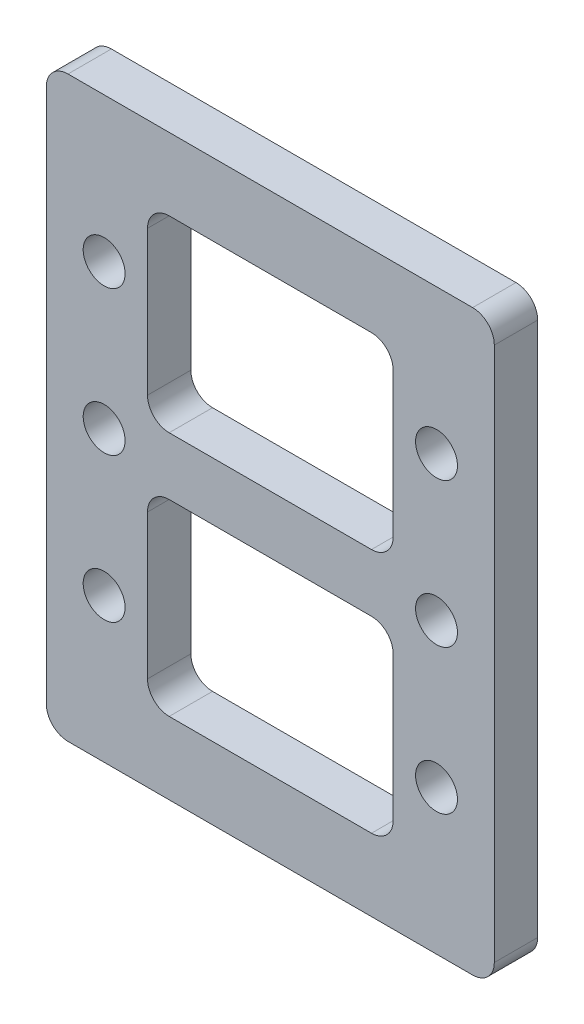
ISO-10303-21;
HEADER;
FILE_DESCRIPTION(('STEP AP214'),'2;1');
FILE_NAME('part.step','',(''),(''),'','','');
FILE_SCHEMA(('AUTOMOTIVE_DESIGN { 1 0 10303 214 1 1 1 1 }'));
ENDSEC;
DATA;
#1=APPLICATION_CONTEXT('core data for automotive mechanical design processes');
#2=APPLICATION_PROTOCOL_DEFINITION('international standard','automotive_design',2000,#1);
#3=PRODUCT_CONTEXT('',#1,'mechanical');
#4=PRODUCT('Part','Part','',(#3));
#5=PRODUCT_RELATED_PRODUCT_CATEGORY('part','',(#4));
#6=PRODUCT_DEFINITION_FORMATION('','',#4);
#7=PRODUCT_DEFINITION_CONTEXT('part definition',#1,'design');
#8=PRODUCT_DEFINITION('design','',#6,#7);
#9=PRODUCT_DEFINITION_SHAPE('','',#8);
#10=(LENGTH_UNIT() NAMED_UNIT(*) SI_UNIT(.MILLI.,.METRE.));
#11=(NAMED_UNIT(*) PLANE_ANGLE_UNIT() SI_UNIT($,.RADIAN.));
#12=(NAMED_UNIT(*) SI_UNIT($,.STERADIAN.) SOLID_ANGLE_UNIT());
#13=UNCERTAINTY_MEASURE_WITH_UNIT(LENGTH_MEASURE(1.E-05),#10,'distance_accuracy_value','');
#14=(GEOMETRIC_REPRESENTATION_CONTEXT(3) GLOBAL_UNCERTAINTY_ASSIGNED_CONTEXT((#13)) GLOBAL_UNIT_ASSIGNED_CONTEXT((#10,
#11,#12)) REPRESENTATION_CONTEXT('',''));
#15=CARTESIAN_POINT('',(0.,0.,0.));
#16=DIRECTION('',(0.,0.,1.));
#17=DIRECTION('',(1.,0.,0.));
#18=AXIS2_PLACEMENT_3D('',#15,#16,#17);
#19=CARTESIAN_POINT('',(0.,0.,3.));
#20=DIRECTION('',(0.,0.,-1.));
#21=DIRECTION('',(-1.,0.,0.));
#22=AXIS2_PLACEMENT_3D('',#19,#20,#21);
#23=PLANE('',#22);
#24=DIRECTION('',(1.,0.,0.));
#25=VECTOR('',#24,1.);
#26=CARTESIAN_POINT('',(7.,22.,3.));
#27=LINE('',#26,#25);
#28=CARTESIAN_POINT('',(8.5,22.,3.));
#29=VERTEX_POINT('',#28);
#30=CARTESIAN_POINT('',(22.5,22.,3.));
#31=VERTEX_POINT('',#30);
#32=EDGE_CURVE('E594',#29,#31,#27,.T.);
#33=ORIENTED_EDGE('',*,*,#32,.F.);
#34=CARTESIAN_POINT('',(8.5,23.5,3.));
#35=DIRECTION('',(0.,0.,-1.));
#36=DIRECTION('',(-1.,0.,0.));
#37=AXIS2_PLACEMENT_3D('',#34,#35,#36);
#38=CIRCLE('',#37,1.5);
#39=CARTESIAN_POINT('',(7.,23.5,3.));
#40=VERTEX_POINT('',#39);
#41=EDGE_CURVE('E361',#29,#40,#38,.T.);
#42=ORIENTED_EDGE('',*,*,#41,.T.);
#43=DIRECTION('',(0.,-1.,0.));
#44=VECTOR('',#43,1.);
#45=CARTESIAN_POINT('',(7.,35.,3.));
#46=LINE('',#45,#44);
#47=CARTESIAN_POINT('',(7.,33.5,3.));
#48=VERTEX_POINT('',#47);
#49=EDGE_CURVE('E401',#48,#40,#46,.T.);
#50=ORIENTED_EDGE('',*,*,#49,.F.);
#51=CARTESIAN_POINT('',(8.5,33.5,3.));
#52=DIRECTION('',(0.,0.,-1.));
#53=DIRECTION('',(-1.,0.,0.));
#54=AXIS2_PLACEMENT_3D('',#51,#52,#53);
#55=CIRCLE('',#54,1.5);
#56=CARTESIAN_POINT('',(8.5,35.,3.));
#57=VERTEX_POINT('',#56);
#58=EDGE_CURVE('E355',#48,#57,#55,.T.);
#59=ORIENTED_EDGE('',*,*,#58,.T.);
#60=DIRECTION('',(-1.,0.,0.));
#61=VECTOR('',#60,1.);
#62=CARTESIAN_POINT('',(7.,35.,3.));
#63=LINE('',#62,#61);
#64=CARTESIAN_POINT('',(22.5,35.,3.));
#65=VERTEX_POINT('',#64);
#66=EDGE_CURVE('E589',#65,#57,#63,.T.);
#67=ORIENTED_EDGE('',*,*,#66,.F.);
#68=CARTESIAN_POINT('',(22.5,33.5,3.));
#69=DIRECTION('',(0.,0.,-1.));
#70=DIRECTION('',(-1.,0.,0.));
#71=AXIS2_PLACEMENT_3D('',#68,#69,#70);
#72=CIRCLE('',#71,1.5);
#73=CARTESIAN_POINT('',(24.,33.5,3.));
#74=VERTEX_POINT('',#73);
#75=EDGE_CURVE('E349',#65,#74,#72,.T.);
#76=ORIENTED_EDGE('',*,*,#75,.T.);
#77=DIRECTION('',(0.,1.,0.));
#78=VECTOR('',#77,1.);
#79=CARTESIAN_POINT('',(24.,35.,3.));
#80=LINE('',#79,#78);
#81=CARTESIAN_POINT('',(24.,23.5,3.));
#82=VERTEX_POINT('',#81);
#83=EDGE_CURVE('E588',#82,#74,#80,.T.);
#84=ORIENTED_EDGE('',*,*,#83,.F.);
#85=CARTESIAN_POINT('',(22.5,23.5,3.));
#86=DIRECTION('',(0.,0.,-1.));
#87=DIRECTION('',(-1.,0.,0.));
#88=AXIS2_PLACEMENT_3D('',#85,#86,#87);
#89=CIRCLE('',#88,1.5);
#90=EDGE_CURVE('E343',#82,#31,#89,.T.);
#91=ORIENTED_EDGE('',*,*,#90,.T.);
#92=EDGE_LOOP('',(#33,#42,#50,#59,#67,#76,#84,#91));
#93=FACE_BOUND('',#92,.T.);
#94=DIRECTION('',(1.,0.,0.));
#95=VECTOR('',#94,1.);
#96=CARTESIAN_POINT('',(7.,4.99999999999999,3.));
#97=LINE('',#96,#95);
#98=CARTESIAN_POINT('',(8.5,4.99999999999999,3.));
#99=VERTEX_POINT('',#98);
#100=CARTESIAN_POINT('',(22.5,4.99999999999999,3.));
#101=VERTEX_POINT('',#100);
#102=EDGE_CURVE('E391',#99,#101,#97,.T.);
#103=ORIENTED_EDGE('',*,*,#102,.F.);
#104=CARTESIAN_POINT('',(8.5,6.49999999999999,3.));
#105=DIRECTION('',(0.,0.,-1.));
#106=DIRECTION('',(-1.,0.,0.));
#107=AXIS2_PLACEMENT_3D('',#104,#105,#106);
#108=CIRCLE('',#107,1.5);
#109=CARTESIAN_POINT('',(7.,6.5,3.));
#110=VERTEX_POINT('',#109);
#111=EDGE_CURVE('E54',#99,#110,#108,.T.);
#112=ORIENTED_EDGE('',*,*,#111,.T.);
#113=DIRECTION('',(0.,-1.,0.));
#114=VECTOR('',#113,1.);
#115=CARTESIAN_POINT('',(7.,18.,3.));
#116=LINE('',#115,#114);
#117=CARTESIAN_POINT('',(7.,16.5,3.));
#118=VERTEX_POINT('',#117);
#119=EDGE_CURVE('E389',#118,#110,#116,.T.);
#120=ORIENTED_EDGE('',*,*,#119,.F.);
#121=CARTESIAN_POINT('',(8.5,16.5,3.));
#122=DIRECTION('',(0.,0.,-1.));
#123=DIRECTION('',(-1.,0.,0.));
#124=AXIS2_PLACEMENT_3D('',#121,#122,#123);
#125=CIRCLE('',#124,1.5);
#126=CARTESIAN_POINT('',(8.5,18.,3.));
#127=VERTEX_POINT('',#126);
#128=EDGE_CURVE('E379',#118,#127,#125,.T.);
#129=ORIENTED_EDGE('',*,*,#128,.T.);
#130=DIRECTION('',(-1.,0.,0.));
#131=VECTOR('',#130,1.);
#132=CARTESIAN_POINT('',(7.,18.,3.));
#133=LINE('',#132,#131);
#134=CARTESIAN_POINT('',(22.5,18.,3.));
#135=VERTEX_POINT('',#134);
#136=EDGE_CURVE('E421',#135,#127,#133,.T.);
#137=ORIENTED_EDGE('',*,*,#136,.F.);
#138=CARTESIAN_POINT('',(22.5,16.5,3.));
#139=DIRECTION('',(0.,0.,-1.));
#140=DIRECTION('',(-1.,0.,0.));
#141=AXIS2_PLACEMENT_3D('',#138,#139,#140);
#142=CIRCLE('',#141,1.5);
#143=CARTESIAN_POINT('',(24.,16.5,3.));
#144=VERTEX_POINT('',#143);
#145=EDGE_CURVE('E373',#135,#144,#142,.T.);
#146=ORIENTED_EDGE('',*,*,#145,.T.);
#147=DIRECTION('',(0.,1.,0.));
#148=VECTOR('',#147,1.);
#149=CARTESIAN_POINT('',(24.,18.,3.));
#150=LINE('',#149,#148);
#151=CARTESIAN_POINT('',(24.,6.5,3.));
#152=VERTEX_POINT('',#151);
#153=EDGE_CURVE('E607',#152,#144,#150,.T.);
#154=ORIENTED_EDGE('',*,*,#153,.F.);
#155=CARTESIAN_POINT('',(22.5,6.49999999999999,3.));
#156=DIRECTION('',(0.,0.,-1.));
#157=DIRECTION('',(-1.,0.,0.));
#158=AXIS2_PLACEMENT_3D('',#155,#156,#157);
#159=CIRCLE('',#158,1.5);
#160=EDGE_CURVE('E367',#152,#101,#159,.T.);
#161=ORIENTED_EDGE('',*,*,#160,.T.);
#162=EDGE_LOOP('',(#103,#112,#120,#129,#137,#146,#154,#161));
#163=FACE_BOUND('',#162,.T.);
#164=DIRECTION('',(0.,1.,0.));
#165=VECTOR('',#164,1.);
#166=CARTESIAN_POINT('',(31.,0.,3.));
#167=LINE('',#166,#165);
#168=CARTESIAN_POINT('',(31.,1.5,3.));
#169=VERTEX_POINT('',#168);
#170=CARTESIAN_POINT('',(31.,38.5,3.));
#171=VERTEX_POINT('',#170);
#172=EDGE_CURVE('E480',#169,#171,#167,.T.);
#173=ORIENTED_EDGE('',*,*,#172,.T.);
#174=CARTESIAN_POINT('',(29.5,38.5,3.));
#175=DIRECTION('',(0.,0.,-1.));
#176=DIRECTION('',(-1.,0.,0.));
#177=AXIS2_PLACEMENT_3D('',#174,#175,#176);
#178=CIRCLE('',#177,1.5);
#179=CARTESIAN_POINT('',(29.5,40.,3.));
#180=VERTEX_POINT('',#179);
#181=EDGE_CURVE('E271',#171,#180,#178,.F.);
#182=ORIENTED_EDGE('',*,*,#181,.T.);
#183=DIRECTION('',(-1.,0.,0.));
#184=VECTOR('',#183,1.);
#185=CARTESIAN_POINT('',(0.,40.,3.));
#186=LINE('',#185,#184);
#187=CARTESIAN_POINT('',(1.5,40.,3.));
#188=VERTEX_POINT('',#187);
#189=EDGE_CURVE('E229',#180,#188,#186,.T.);
#190=ORIENTED_EDGE('',*,*,#189,.T.);
#191=CARTESIAN_POINT('',(1.5,38.5,3.));
#192=DIRECTION('',(0.,0.,-1.));
#193=DIRECTION('',(-1.,0.,0.));
#194=AXIS2_PLACEMENT_3D('',#191,#192,#193);
#195=CIRCLE('',#194,1.5);
#196=CARTESIAN_POINT('',(0.,38.5,3.));
#197=VERTEX_POINT('',#196);
#198=EDGE_CURVE('E263',#188,#197,#195,.F.);
#199=ORIENTED_EDGE('',*,*,#198,.T.);
#200=DIRECTION('',(0.,-1.,0.));
#201=VECTOR('',#200,1.);
#202=CARTESIAN_POINT('',(0.,0.,3.));
#203=LINE('',#202,#201);
#204=CARTESIAN_POINT('',(0.,1.5,3.));
#205=VERTEX_POINT('',#204);
#206=EDGE_CURVE('E238',#197,#205,#203,.T.);
#207=ORIENTED_EDGE('',*,*,#206,.T.);
#208=CARTESIAN_POINT('',(1.5,1.5,3.));
#209=DIRECTION('',(0.,0.,-1.));
#210=DIRECTION('',(-1.,0.,0.));
#211=AXIS2_PLACEMENT_3D('',#208,#209,#210);
#212=CIRCLE('',#211,1.5);
#213=CARTESIAN_POINT('',(1.5,0.,3.));
#214=VERTEX_POINT('',#213);
#215=EDGE_CURVE('E68',#205,#214,#212,.F.);
#216=ORIENTED_EDGE('',*,*,#215,.T.);
#217=DIRECTION('',(1.,0.,0.));
#218=VECTOR('',#217,1.);
#219=CARTESIAN_POINT('',(0.,0.,3.));
#220=LINE('',#219,#218);
#221=CARTESIAN_POINT('',(29.5,0.,3.));
#222=VERTEX_POINT('',#221);
#223=EDGE_CURVE('E243',#214,#222,#220,.T.);
#224=ORIENTED_EDGE('',*,*,#223,.T.);
#225=CARTESIAN_POINT('',(29.5,1.5,3.));
#226=DIRECTION('',(0.,0.,-1.));
#227=DIRECTION('',(-1.,0.,0.));
#228=AXIS2_PLACEMENT_3D('',#225,#226,#227);
#229=CIRCLE('',#228,1.5);
#230=EDGE_CURVE('E268',#222,#169,#229,.F.);
#231=ORIENTED_EDGE('',*,*,#230,.T.);
#232=EDGE_LOOP('',(#173,#182,#190,#199,#207,#216,#224,#231));
#233=FACE_BOUND('',#232,.T.);
#234=CARTESIAN_POINT('',(4.,30.,3.));
#235=DIRECTION('',(0.,0.,1.));
#236=DIRECTION('',(1.,0.,0.));
#237=AXIS2_PLACEMENT_3D('',#234,#235,#236);
#238=CIRCLE('',#237,1.45);
#239=CARTESIAN_POINT('',(5.45,30.,3.));
#240=VERTEX_POINT('',#239);
#241=EDGE_CURVE('E470',#240,#240,#238,.T.);
#242=ORIENTED_EDGE('',*,*,#241,.F.);
#243=EDGE_LOOP('',(#242));
#244=FACE_BOUND('',#243,.T.);
#245=CARTESIAN_POINT('',(4.,20.,3.));
#246=DIRECTION('',(0.,0.,1.));
#247=DIRECTION('',(1.,0.,0.));
#248=AXIS2_PLACEMENT_3D('',#245,#246,#247);
#249=CIRCLE('',#248,1.45);
#250=CARTESIAN_POINT('',(5.45,20.,3.));
#251=VERTEX_POINT('',#250);
#252=EDGE_CURVE('E462',#251,#251,#249,.T.);
#253=ORIENTED_EDGE('',*,*,#252,.F.);
#254=EDGE_LOOP('',(#253));
#255=FACE_BOUND('',#254,.T.);
#256=CARTESIAN_POINT('',(4.,10.,3.));
#257=DIRECTION('',(0.,0.,1.));
#258=DIRECTION('',(1.,0.,0.));
#259=AXIS2_PLACEMENT_3D('',#256,#257,#258);
#260=CIRCLE('',#259,1.45);
#261=CARTESIAN_POINT('',(5.45,10.,3.));
#262=VERTEX_POINT('',#261);
#263=EDGE_CURVE('E454',#262,#262,#260,.T.);
#264=ORIENTED_EDGE('',*,*,#263,.F.);
#265=EDGE_LOOP('',(#264));
#266=FACE_BOUND('',#265,.T.);
#267=CARTESIAN_POINT('',(27.,30.,3.));
#268=DIRECTION('',(0.,0.,1.));
#269=DIRECTION('',(1.,0.,0.));
#270=AXIS2_PLACEMENT_3D('',#267,#268,#269);
#271=CIRCLE('',#270,1.45);
#272=CARTESIAN_POINT('',(28.45,30.,3.));
#273=VERTEX_POINT('',#272);
#274=EDGE_CURVE('E446',#273,#273,#271,.T.);
#275=ORIENTED_EDGE('',*,*,#274,.F.);
#276=EDGE_LOOP('',(#275));
#277=FACE_BOUND('',#276,.T.);
#278=CARTESIAN_POINT('',(27.,20.,3.));
#279=DIRECTION('',(0.,0.,1.));
#280=DIRECTION('',(1.,0.,0.));
#281=AXIS2_PLACEMENT_3D('',#278,#279,#280);
#282=CIRCLE('',#281,1.45);
#283=CARTESIAN_POINT('',(28.45,20.,3.));
#284=VERTEX_POINT('',#283);
#285=EDGE_CURVE('E438',#284,#284,#282,.T.);
#286=ORIENTED_EDGE('',*,*,#285,.F.);
#287=EDGE_LOOP('',(#286));
#288=FACE_BOUND('',#287,.T.);
#289=CARTESIAN_POINT('',(27.,10.,3.));
#290=DIRECTION('',(0.,0.,1.));
#291=DIRECTION('',(1.,0.,0.));
#292=AXIS2_PLACEMENT_3D('',#289,#290,#291);
#293=CIRCLE('',#292,1.45);
#294=CARTESIAN_POINT('',(28.45,10.,3.));
#295=VERTEX_POINT('',#294);
#296=EDGE_CURVE('E428',#295,#295,#293,.T.);
#297=ORIENTED_EDGE('',*,*,#296,.F.);
#298=EDGE_LOOP('',(#297));
#299=FACE_BOUND('',#298,.T.);
#300=ADVANCED_FACE('F45',(#93,#163,#233,#244,#255,#266,#277,#288,#299),#23,.F.);
#301=CARTESIAN_POINT('',(0.,0.,0.));
#302=DIRECTION('',(0.,0.,-1.));
#303=DIRECTION('',(-1.,0.,0.));
#304=AXIS2_PLACEMENT_3D('',#301,#302,#303);
#305=PLANE('',#304);
#306=DIRECTION('',(-1.,0.,0.));
#307=VECTOR('',#306,1.);
#308=CARTESIAN_POINT('',(7.,35.,0.));
#309=LINE('',#308,#307);
#310=CARTESIAN_POINT('',(22.5,35.,0.));
#311=VERTEX_POINT('',#310);
#312=CARTESIAN_POINT('',(8.5,35.,0.));
#313=VERTEX_POINT('',#312);
#314=EDGE_CURVE('E437',#311,#313,#309,.T.);
#315=ORIENTED_EDGE('',*,*,#314,.T.);
#316=CARTESIAN_POINT('',(8.5,33.5,0.));
#317=DIRECTION('',(0.,0.,-1.));
#318=DIRECTION('',(-1.,0.,0.));
#319=AXIS2_PLACEMENT_3D('',#316,#317,#318);
#320=CIRCLE('',#319,1.5);
#321=CARTESIAN_POINT('',(7.,33.5,0.));
#322=VERTEX_POINT('',#321);
#323=EDGE_CURVE('E358',#313,#322,#320,.F.);
#324=ORIENTED_EDGE('',*,*,#323,.T.);
#325=DIRECTION('',(0.,-1.,0.));
#326=VECTOR('',#325,1.);
#327=CARTESIAN_POINT('',(7.,35.,0.));
#328=LINE('',#327,#326);
#329=CARTESIAN_POINT('',(7.,23.5,0.));
#330=VERTEX_POINT('',#329);
#331=EDGE_CURVE('E598',#322,#330,#328,.T.);
#332=ORIENTED_EDGE('',*,*,#331,.T.);
#333=CARTESIAN_POINT('',(8.5,23.5,0.));
#334=DIRECTION('',(0.,0.,-1.));
#335=DIRECTION('',(-1.,0.,0.));
#336=AXIS2_PLACEMENT_3D('',#333,#334,#335);
#337=CIRCLE('',#336,1.5);
#338=CARTESIAN_POINT('',(8.5,22.,0.));
#339=VERTEX_POINT('',#338);
#340=EDGE_CURVE('E364',#330,#339,#337,.F.);
#341=ORIENTED_EDGE('',*,*,#340,.T.);
#342=DIRECTION('',(1.,0.,0.));
#343=VECTOR('',#342,1.);
#344=CARTESIAN_POINT('',(7.,22.,0.));
#345=LINE('',#344,#343);
#346=CARTESIAN_POINT('',(22.5,22.,0.));
#347=VERTEX_POINT('',#346);
#348=EDGE_CURVE('E682',#339,#347,#345,.T.);
#349=ORIENTED_EDGE('',*,*,#348,.T.);
#350=CARTESIAN_POINT('',(22.5,23.5,0.));
#351=DIRECTION('',(0.,0.,-1.));
#352=DIRECTION('',(-1.,0.,0.));
#353=AXIS2_PLACEMENT_3D('',#350,#351,#352);
#354=CIRCLE('',#353,1.5);
#355=CARTESIAN_POINT('',(24.,23.5,0.));
#356=VERTEX_POINT('',#355);
#357=EDGE_CURVE('E346',#347,#356,#354,.F.);
#358=ORIENTED_EDGE('',*,*,#357,.T.);
#359=DIRECTION('',(0.,1.,0.));
#360=VECTOR('',#359,1.);
#361=CARTESIAN_POINT('',(24.,35.,0.));
#362=LINE('',#361,#360);
#363=CARTESIAN_POINT('',(24.,33.5,0.));
#364=VERTEX_POINT('',#363);
#365=EDGE_CURVE('E580',#356,#364,#362,.T.);
#366=ORIENTED_EDGE('',*,*,#365,.T.);
#367=CARTESIAN_POINT('',(22.5,33.5,0.));
#368=DIRECTION('',(0.,0.,-1.));
#369=DIRECTION('',(-1.,0.,0.));
#370=AXIS2_PLACEMENT_3D('',#367,#368,#369);
#371=CIRCLE('',#370,1.5);
#372=EDGE_CURVE('E352',#364,#311,#371,.F.);
#373=ORIENTED_EDGE('',*,*,#372,.T.);
#374=EDGE_LOOP('',(#315,#324,#332,#341,#349,#358,#366,#373));
#375=FACE_BOUND('',#374,.T.);
#376=DIRECTION('',(-1.,0.,0.));
#377=VECTOR('',#376,1.);
#378=CARTESIAN_POINT('',(7.,18.,0.));
#379=LINE('',#378,#377);
#380=CARTESIAN_POINT('',(22.5,18.,0.));
#381=VERTEX_POINT('',#380);
#382=CARTESIAN_POINT('',(8.5,18.,0.));
#383=VERTEX_POINT('',#382);
#384=EDGE_CURVE('E424',#381,#383,#379,.T.);
#385=ORIENTED_EDGE('',*,*,#384,.T.);
#386=CARTESIAN_POINT('',(8.5,16.5,0.));
#387=DIRECTION('',(0.,0.,-1.));
#388=DIRECTION('',(-1.,0.,0.));
#389=AXIS2_PLACEMENT_3D('',#386,#387,#388);
#390=CIRCLE('',#389,1.5);
#391=CARTESIAN_POINT('',(7.,16.5,0.));
#392=VERTEX_POINT('',#391);
#393=EDGE_CURVE('E382',#383,#392,#390,.F.);
#394=ORIENTED_EDGE('',*,*,#393,.T.);
#395=DIRECTION('',(0.,-1.,0.));
#396=VECTOR('',#395,1.);
#397=CARTESIAN_POINT('',(7.,18.,0.));
#398=LINE('',#397,#396);
#399=CARTESIAN_POINT('',(7.,6.5,0.));
#400=VERTEX_POINT('',#399);
#401=EDGE_CURVE('E412',#392,#400,#398,.T.);
#402=ORIENTED_EDGE('',*,*,#401,.T.);
#403=CARTESIAN_POINT('',(8.5,6.49999999999999,0.));
#404=DIRECTION('',(0.,0.,-1.));
#405=DIRECTION('',(-1.,0.,0.));
#406=AXIS2_PLACEMENT_3D('',#403,#404,#405);
#407=CIRCLE('',#406,1.5);
#408=CARTESIAN_POINT('',(8.5,4.99999999999999,0.));
#409=VERTEX_POINT('',#408);
#410=EDGE_CURVE('E11',#400,#409,#407,.F.);
#411=ORIENTED_EDGE('',*,*,#410,.T.);
#412=DIRECTION('',(1.,0.,0.));
#413=VECTOR('',#412,1.);
#414=CARTESIAN_POINT('',(7.,4.99999999999999,0.));
#415=LINE('',#414,#413);
#416=CARTESIAN_POINT('',(22.5,4.99999999999999,0.));
#417=VERTEX_POINT('',#416);
#418=EDGE_CURVE('E410',#409,#417,#415,.T.);
#419=ORIENTED_EDGE('',*,*,#418,.T.);
#420=CARTESIAN_POINT('',(22.5,6.49999999999999,0.));
#421=DIRECTION('',(0.,0.,-1.));
#422=DIRECTION('',(-1.,0.,0.));
#423=AXIS2_PLACEMENT_3D('',#420,#421,#422);
#424=CIRCLE('',#423,1.5);
#425=CARTESIAN_POINT('',(24.,6.5,0.));
#426=VERTEX_POINT('',#425);
#427=EDGE_CURVE('E370',#417,#426,#424,.F.);
#428=ORIENTED_EDGE('',*,*,#427,.T.);
#429=DIRECTION('',(0.,1.,0.));
#430=VECTOR('',#429,1.);
#431=CARTESIAN_POINT('',(24.,18.,0.));
#432=LINE('',#431,#430);
#433=CARTESIAN_POINT('',(24.,16.5,0.));
#434=VERTEX_POINT('',#433);
#435=EDGE_CURVE('E417',#426,#434,#432,.T.);
#436=ORIENTED_EDGE('',*,*,#435,.T.);
#437=CARTESIAN_POINT('',(22.5,16.5,0.));
#438=DIRECTION('',(0.,0.,-1.));
#439=DIRECTION('',(-1.,0.,0.));
#440=AXIS2_PLACEMENT_3D('',#437,#438,#439);
#441=CIRCLE('',#440,1.5);
#442=EDGE_CURVE('E376',#434,#381,#441,.F.);
#443=ORIENTED_EDGE('',*,*,#442,.T.);
#444=EDGE_LOOP('',(#385,#394,#402,#411,#419,#428,#436,#443));
#445=FACE_BOUND('',#444,.T.);
#446=CARTESIAN_POINT('',(27.,20.,0.));
#447=DIRECTION('',(0.,0.,1.));
#448=DIRECTION('',(1.,0.,0.));
#449=AXIS2_PLACEMENT_3D('',#446,#447,#448);
#450=CIRCLE('',#449,1.45);
#451=CARTESIAN_POINT('',(28.45,20.,0.));
#452=VERTEX_POINT('',#451);
#453=EDGE_CURVE('E432',#452,#452,#450,.T.);
#454=ORIENTED_EDGE('',*,*,#453,.T.);
#455=EDGE_LOOP('',(#454));
#456=FACE_BOUND('',#455,.T.);
#457=CARTESIAN_POINT('',(4.,10.,0.));
#458=DIRECTION('',(0.,0.,1.));
#459=DIRECTION('',(1.,0.,0.));
#460=AXIS2_PLACEMENT_3D('',#457,#458,#459);
#461=CIRCLE('',#460,1.45);
#462=CARTESIAN_POINT('',(5.45,10.,0.));
#463=VERTEX_POINT('',#462);
#464=EDGE_CURVE('E450',#463,#463,#461,.T.);
#465=ORIENTED_EDGE('',*,*,#464,.T.);
#466=EDGE_LOOP('',(#465));
#467=FACE_BOUND('',#466,.T.);
#468=CARTESIAN_POINT('',(4.,30.,0.));
#469=DIRECTION('',(0.,0.,1.));
#470=DIRECTION('',(1.,0.,0.));
#471=AXIS2_PLACEMENT_3D('',#468,#469,#470);
#472=CIRCLE('',#471,1.45);
#473=CARTESIAN_POINT('',(5.45,30.,0.));
#474=VERTEX_POINT('',#473);
#475=EDGE_CURVE('E466',#474,#474,#472,.T.);
#476=ORIENTED_EDGE('',*,*,#475,.T.);
#477=EDGE_LOOP('',(#476));
#478=FACE_BOUND('',#477,.T.);
#479=DIRECTION('',(-1.,0.,0.));
#480=VECTOR('',#479,1.);
#481=CARTESIAN_POINT('',(0.,40.,0.));
#482=LINE('',#481,#480);
#483=CARTESIAN_POINT('',(29.5,40.,0.));
#484=VERTEX_POINT('',#483);
#485=CARTESIAN_POINT('',(1.5,40.,0.));
#486=VERTEX_POINT('',#485);
#487=EDGE_CURVE('E226',#484,#486,#482,.T.);
#488=ORIENTED_EDGE('',*,*,#487,.F.);
#489=CARTESIAN_POINT('',(29.5,38.5,0.));
#490=DIRECTION('',(0.,0.,-1.));
#491=DIRECTION('',(-1.,0.,0.));
#492=AXIS2_PLACEMENT_3D('',#489,#490,#491);
#493=CIRCLE('',#492,1.5);
#494=CARTESIAN_POINT('',(31.,38.5,0.));
#495=VERTEX_POINT('',#494);
#496=EDGE_CURVE('E208',#484,#495,#493,.T.);
#497=ORIENTED_EDGE('',*,*,#496,.T.);
#498=DIRECTION('',(0.,1.,0.));
#499=VECTOR('',#498,1.);
#500=CARTESIAN_POINT('',(31.,0.,0.));
#501=LINE('',#500,#499);
#502=CARTESIAN_POINT('',(31.,1.5,0.));
#503=VERTEX_POINT('',#502);
#504=EDGE_CURVE('E239',#503,#495,#501,.T.);
#505=ORIENTED_EDGE('',*,*,#504,.F.);
#506=CARTESIAN_POINT('',(29.5,1.5,0.));
#507=DIRECTION('',(0.,0.,-1.));
#508=DIRECTION('',(-1.,0.,0.));
#509=AXIS2_PLACEMENT_3D('',#506,#507,#508);
#510=CIRCLE('',#509,1.5);
#511=CARTESIAN_POINT('',(29.5,0.,0.));
#512=VERTEX_POINT('',#511);
#513=EDGE_CURVE('E220',#503,#512,#510,.T.);
#514=ORIENTED_EDGE('',*,*,#513,.T.);
#515=DIRECTION('',(1.,0.,0.));
#516=VECTOR('',#515,1.);
#517=CARTESIAN_POINT('',(0.,0.,0.));
#518=LINE('',#517,#516);
#519=CARTESIAN_POINT('',(1.5,0.,0.));
#520=VERTEX_POINT('',#519);
#521=EDGE_CURVE('E245',#520,#512,#518,.T.);
#522=ORIENTED_EDGE('',*,*,#521,.F.);
#523=CARTESIAN_POINT('',(1.5,1.5,0.));
#524=DIRECTION('',(0.,0.,-1.));
#525=DIRECTION('',(-1.,0.,0.));
#526=AXIS2_PLACEMENT_3D('',#523,#524,#525);
#527=CIRCLE('',#526,1.5);
#528=CARTESIAN_POINT('',(0.,1.5,0.));
#529=VERTEX_POINT('',#528);
#530=EDGE_CURVE('E253',#520,#529,#527,.T.);
#531=ORIENTED_EDGE('',*,*,#530,.T.);
#532=DIRECTION('',(0.,-1.,0.));
#533=VECTOR('',#532,1.);
#534=CARTESIAN_POINT('',(0.,0.,0.));
#535=LINE('',#534,#533);
#536=CARTESIAN_POINT('',(0.,38.5,0.));
#537=VERTEX_POINT('',#536);
#538=EDGE_CURVE('E474',#537,#529,#535,.T.);
#539=ORIENTED_EDGE('',*,*,#538,.F.);
#540=CARTESIAN_POINT('',(1.5,38.5,0.));
#541=DIRECTION('',(0.,0.,-1.));
#542=DIRECTION('',(-1.,0.,0.));
#543=AXIS2_PLACEMENT_3D('',#540,#541,#542);
#544=CIRCLE('',#543,1.5);
#545=EDGE_CURVE('E231',#537,#486,#544,.T.);
#546=ORIENTED_EDGE('',*,*,#545,.T.);
#547=EDGE_LOOP('',(#488,#497,#505,#514,#522,#531,#539,#546));
#548=FACE_BOUND('',#547,.T.);
#549=CARTESIAN_POINT('',(4.,20.,0.));
#550=DIRECTION('',(0.,0.,1.));
#551=DIRECTION('',(1.,0.,0.));
#552=AXIS2_PLACEMENT_3D('',#549,#550,#551);
#553=CIRCLE('',#552,1.45);
#554=CARTESIAN_POINT('',(5.45,20.,0.));
#555=VERTEX_POINT('',#554);
#556=EDGE_CURVE('E458',#555,#555,#553,.T.);
#557=ORIENTED_EDGE('',*,*,#556,.T.);
#558=EDGE_LOOP('',(#557));
#559=FACE_BOUND('',#558,.T.);
#560=CARTESIAN_POINT('',(27.,30.,0.));
#561=DIRECTION('',(0.,0.,1.));
#562=DIRECTION('',(1.,0.,0.));
#563=AXIS2_PLACEMENT_3D('',#560,#561,#562);
#564=CIRCLE('',#563,1.45);
#565=CARTESIAN_POINT('',(28.45,30.,0.));
#566=VERTEX_POINT('',#565);
#567=EDGE_CURVE('E442',#566,#566,#564,.T.);
#568=ORIENTED_EDGE('',*,*,#567,.T.);
#569=EDGE_LOOP('',(#568));
#570=FACE_BOUND('',#569,.T.);
#571=CARTESIAN_POINT('',(27.,10.,0.));
#572=DIRECTION('',(0.,0.,1.));
#573=DIRECTION('',(1.,0.,0.));
#574=AXIS2_PLACEMENT_3D('',#571,#572,#573);
#575=CIRCLE('',#574,1.45);
#576=CARTESIAN_POINT('',(28.45,10.,0.));
#577=VERTEX_POINT('',#576);
#578=EDGE_CURVE('E433',#577,#577,#575,.T.);
#579=ORIENTED_EDGE('',*,*,#578,.T.);
#580=EDGE_LOOP('',(#579));
#581=FACE_BOUND('',#580,.T.);
#582=ADVANCED_FACE('F234',(#375,#445,#456,#467,#478,#548,#559,#570,#581),#305,.T.);
#583=CARTESIAN_POINT('',(0.,0.,3.));
#584=DIRECTION('',(1.,0.,0.));
#585=DIRECTION('',(0.,0.,-1.));
#586=AXIS2_PLACEMENT_3D('',#583,#584,#585);
#587=PLANE('',#586);
#588=ORIENTED_EDGE('',*,*,#538,.T.);
#589=DIRECTION('',(0.,0.,-1.));
#590=VECTOR('',#589,1.);
#591=CARTESIAN_POINT('',(0.,1.5,3.));
#592=LINE('',#591,#590);
#593=EDGE_CURVE('E284',#529,#205,#592,.F.);
#594=ORIENTED_EDGE('',*,*,#593,.T.);
#595=ORIENTED_EDGE('',*,*,#206,.F.);
#596=DIRECTION('',(0.,0.,-1.));
#597=VECTOR('',#596,1.);
#598=CARTESIAN_POINT('',(0.,38.5,3.));
#599=LINE('',#598,#597);
#600=EDGE_CURVE('E280',#197,#537,#599,.T.);
#601=ORIENTED_EDGE('',*,*,#600,.T.);
#602=EDGE_LOOP('',(#588,#594,#595,#601));
#603=FACE_BOUND('',#602,.T.);
#604=ADVANCED_FACE('F508',(#603),#587,.F.);
#605=CARTESIAN_POINT('',(0.,0.,3.));
#606=DIRECTION('',(0.,1.,0.));
#607=DIRECTION('',(0.,0.,1.));
#608=AXIS2_PLACEMENT_3D('',#605,#606,#607);
#609=PLANE('',#608);
#610=ORIENTED_EDGE('',*,*,#521,.T.);
#611=DIRECTION('',(0.,0.,-1.));
#612=VECTOR('',#611,1.);
#613=CARTESIAN_POINT('',(29.5,0.,3.));
#614=LINE('',#613,#612);
#615=EDGE_CURVE('E61',#512,#222,#614,.F.);
#616=ORIENTED_EDGE('',*,*,#615,.T.);
#617=ORIENTED_EDGE('',*,*,#223,.F.);
#618=DIRECTION('',(0.,0.,-1.));
#619=VECTOR('',#618,1.);
#620=CARTESIAN_POINT('',(1.5,0.,3.));
#621=LINE('',#620,#619);
#622=EDGE_CURVE('E274',#214,#520,#621,.T.);
#623=ORIENTED_EDGE('',*,*,#622,.T.);
#624=EDGE_LOOP('',(#610,#616,#617,#623));
#625=FACE_BOUND('',#624,.T.);
#626=ADVANCED_FACE('F490',(#625),#609,.F.);
#627=CARTESIAN_POINT('',(31.,0.,3.));
#628=DIRECTION('',(-1.,0.,0.));
#629=DIRECTION('',(0.,-1.,0.));
#630=AXIS2_PLACEMENT_3D('',#627,#628,#629);
#631=PLANE('',#630);
#632=ORIENTED_EDGE('',*,*,#504,.T.);
#633=DIRECTION('',(0.,0.,-1.));
#634=VECTOR('',#633,1.);
#635=CARTESIAN_POINT('',(31.,38.5,3.));
#636=LINE('',#635,#634);
#637=EDGE_CURVE('E213',#495,#171,#636,.F.);
#638=ORIENTED_EDGE('',*,*,#637,.T.);
#639=ORIENTED_EDGE('',*,*,#172,.F.);
#640=DIRECTION('',(0.,0.,-1.));
#641=VECTOR('',#640,1.);
#642=CARTESIAN_POINT('',(31.,1.5,3.));
#643=LINE('',#642,#641);
#644=EDGE_CURVE('E219',#169,#503,#643,.T.);
#645=ORIENTED_EDGE('',*,*,#644,.T.);
#646=EDGE_LOOP('',(#632,#638,#639,#645));
#647=FACE_BOUND('',#646,.T.);
#648=ADVANCED_FACE('F499',(#647),#631,.F.);
#649=CARTESIAN_POINT('',(0.,40.,3.));
#650=DIRECTION('',(0.,-1.,0.));
#651=DIRECTION('',(0.,0.,-1.));
#652=AXIS2_PLACEMENT_3D('',#649,#650,#651);
#653=PLANE('',#652);
#654=ORIENTED_EDGE('',*,*,#189,.F.);
#655=DIRECTION('',(0.,0.,-1.));
#656=VECTOR('',#655,1.);
#657=CARTESIAN_POINT('',(29.5,40.,3.));
#658=LINE('',#657,#656);
#659=EDGE_CURVE('E212',#180,#484,#658,.T.);
#660=ORIENTED_EDGE('',*,*,#659,.T.);
#661=ORIENTED_EDGE('',*,*,#487,.T.);
#662=DIRECTION('',(0.,0.,-1.));
#663=VECTOR('',#662,1.);
#664=CARTESIAN_POINT('',(1.5,40.,3.));
#665=LINE('',#664,#663);
#666=EDGE_CURVE('E232',#486,#188,#665,.F.);
#667=ORIENTED_EDGE('',*,*,#666,.T.);
#668=EDGE_LOOP('',(#654,#660,#661,#667));
#669=FACE_BOUND('',#668,.T.);
#670=ADVANCED_FACE('F225',(#669),#653,.F.);
#671=CARTESIAN_POINT('',(4.,30.,3.));
#672=DIRECTION('',(0.,0.,-1.));
#673=DIRECTION('',(-1.,0.,0.));
#674=AXIS2_PLACEMENT_3D('',#671,#672,#673);
#675=CYLINDRICAL_SURFACE('',#674,1.45);
#676=ORIENTED_EDGE('',*,*,#241,.T.);
#677=EDGE_LOOP('',(#676));
#678=FACE_BOUND('',#677,.T.);
#679=ORIENTED_EDGE('',*,*,#475,.F.);
#680=EDGE_LOOP('',(#679));
#681=FACE_BOUND('',#680,.T.);
#682=ADVANCED_FACE('F506',(#678,#681),#675,.F.);
#683=CARTESIAN_POINT('',(4.,20.,3.));
#684=DIRECTION('',(0.,0.,-1.));
#685=DIRECTION('',(-1.,0.,0.));
#686=AXIS2_PLACEMENT_3D('',#683,#684,#685);
#687=CYLINDRICAL_SURFACE('',#686,1.45);
#688=ORIENTED_EDGE('',*,*,#252,.T.);
#689=EDGE_LOOP('',(#688));
#690=FACE_BOUND('',#689,.T.);
#691=ORIENTED_EDGE('',*,*,#556,.F.);
#692=EDGE_LOOP('',(#691));
#693=FACE_BOUND('',#692,.T.);
#694=ADVANCED_FACE('F523',(#690,#693),#687,.F.);
#695=CARTESIAN_POINT('',(4.,10.,3.));
#696=DIRECTION('',(0.,0.,-1.));
#697=DIRECTION('',(-1.,0.,0.));
#698=AXIS2_PLACEMENT_3D('',#695,#696,#697);
#699=CYLINDRICAL_SURFACE('',#698,1.45);
#700=ORIENTED_EDGE('',*,*,#263,.T.);
#701=EDGE_LOOP('',(#700));
#702=FACE_BOUND('',#701,.T.);
#703=ORIENTED_EDGE('',*,*,#464,.F.);
#704=EDGE_LOOP('',(#703));
#705=FACE_BOUND('',#704,.T.);
#706=ADVANCED_FACE('F527',(#702,#705),#699,.F.);
#707=CARTESIAN_POINT('',(27.,30.,3.));
#708=DIRECTION('',(0.,0.,-1.));
#709=DIRECTION('',(-1.,0.,0.));
#710=AXIS2_PLACEMENT_3D('',#707,#708,#709);
#711=CYLINDRICAL_SURFACE('',#710,1.45);
#712=ORIENTED_EDGE('',*,*,#274,.T.);
#713=EDGE_LOOP('',(#712));
#714=FACE_BOUND('',#713,.T.);
#715=ORIENTED_EDGE('',*,*,#567,.F.);
#716=EDGE_LOOP('',(#715));
#717=FACE_BOUND('',#716,.T.);
#718=ADVANCED_FACE('F531',(#714,#717),#711,.F.);
#719=CARTESIAN_POINT('',(27.,20.,3.));
#720=DIRECTION('',(0.,0.,-1.));
#721=DIRECTION('',(-1.,0.,0.));
#722=AXIS2_PLACEMENT_3D('',#719,#720,#721);
#723=CYLINDRICAL_SURFACE('',#722,1.45);
#724=ORIENTED_EDGE('',*,*,#285,.T.);
#725=EDGE_LOOP('',(#724));
#726=FACE_BOUND('',#725,.T.);
#727=ORIENTED_EDGE('',*,*,#453,.F.);
#728=EDGE_LOOP('',(#727));
#729=FACE_BOUND('',#728,.T.);
#730=ADVANCED_FACE('F535',(#726,#729),#723,.F.);
#731=CARTESIAN_POINT('',(27.,10.,3.));
#732=DIRECTION('',(0.,0.,-1.));
#733=DIRECTION('',(-1.,0.,0.));
#734=AXIS2_PLACEMENT_3D('',#731,#732,#733);
#735=CYLINDRICAL_SURFACE('',#734,1.45);
#736=ORIENTED_EDGE('',*,*,#296,.T.);
#737=EDGE_LOOP('',(#736));
#738=FACE_BOUND('',#737,.T.);
#739=ORIENTED_EDGE('',*,*,#578,.F.);
#740=EDGE_LOOP('',(#739));
#741=FACE_BOUND('',#740,.T.);
#742=ADVANCED_FACE('F539',(#738,#741),#735,.F.);
#743=CARTESIAN_POINT('',(7.,18.,0.));
#744=DIRECTION('',(-1.,0.,0.));
#745=DIRECTION('',(0.,-1.,0.));
#746=AXIS2_PLACEMENT_3D('',#743,#744,#745);
#747=PLANE('',#746);
#748=ORIENTED_EDGE('',*,*,#401,.F.);
#749=DIRECTION('',(0.,0.,1.));
#750=VECTOR('',#749,1.);
#751=CARTESIAN_POINT('',(7.,16.5,3.));
#752=LINE('',#751,#750);
#753=EDGE_CURVE('E339',#392,#118,#752,.T.);
#754=ORIENTED_EDGE('',*,*,#753,.T.);
#755=ORIENTED_EDGE('',*,*,#119,.T.);
#756=DIRECTION('',(0.,0.,1.));
#757=VECTOR('',#756,1.);
#758=CARTESIAN_POINT('',(7.,6.49999999999999,0.));
#759=LINE('',#758,#757);
#760=EDGE_CURVE('E336',#110,#400,#759,.F.);
#761=ORIENTED_EDGE('',*,*,#760,.T.);
#762=EDGE_LOOP('',(#748,#754,#755,#761));
#763=FACE_BOUND('',#762,.T.);
#764=ADVANCED_FACE('F397',(#763),#747,.F.);
#765=CARTESIAN_POINT('',(7.,18.,0.));
#766=DIRECTION('',(0.,1.,0.));
#767=DIRECTION('',(0.,0.,1.));
#768=AXIS2_PLACEMENT_3D('',#765,#766,#767);
#769=PLANE('',#768);
#770=ORIENTED_EDGE('',*,*,#384,.F.);
#771=DIRECTION('',(0.,0.,1.));
#772=VECTOR('',#771,1.);
#773=CARTESIAN_POINT('',(22.5,18.,3.));
#774=LINE('',#773,#772);
#775=EDGE_CURVE('E332',#381,#135,#774,.T.);
#776=ORIENTED_EDGE('',*,*,#775,.T.);
#777=ORIENTED_EDGE('',*,*,#136,.T.);
#778=DIRECTION('',(0.,0.,1.));
#779=VECTOR('',#778,1.);
#780=CARTESIAN_POINT('',(8.5,18.,0.));
#781=LINE('',#780,#779);
#782=EDGE_CURVE('E329',#127,#383,#781,.F.);
#783=ORIENTED_EDGE('',*,*,#782,.T.);
#784=EDGE_LOOP('',(#770,#776,#777,#783));
#785=FACE_BOUND('',#784,.T.);
#786=ADVANCED_FACE('F543',(#785),#769,.F.);
#787=CARTESIAN_POINT('',(24.,18.,0.));
#788=DIRECTION('',(1.,0.,0.));
#789=DIRECTION('',(0.,1.,0.));
#790=AXIS2_PLACEMENT_3D('',#787,#788,#789);
#791=PLANE('',#790);
#792=ORIENTED_EDGE('',*,*,#435,.F.);
#793=DIRECTION('',(0.,0.,1.));
#794=VECTOR('',#793,1.);
#795=CARTESIAN_POINT('',(24.,6.49999999999999,3.));
#796=LINE('',#795,#794);
#797=EDGE_CURVE('E318',#426,#152,#796,.T.);
#798=ORIENTED_EDGE('',*,*,#797,.T.);
#799=ORIENTED_EDGE('',*,*,#153,.T.);
#800=DIRECTION('',(0.,0.,1.));
#801=VECTOR('',#800,1.);
#802=CARTESIAN_POINT('',(24.,16.5,0.));
#803=LINE('',#802,#801);
#804=EDGE_CURVE('E315',#144,#434,#803,.F.);
#805=ORIENTED_EDGE('',*,*,#804,.T.);
#806=EDGE_LOOP('',(#792,#798,#799,#805));
#807=FACE_BOUND('',#806,.T.);
#808=ADVANCED_FACE('F546',(#807),#791,.F.);
#809=CARTESIAN_POINT('',(7.,4.99999999999999,0.));
#810=DIRECTION('',(0.,-1.,0.));
#811=DIRECTION('',(0.,0.,-1.));
#812=AXIS2_PLACEMENT_3D('',#809,#810,#811);
#813=PLANE('',#812);
#814=ORIENTED_EDGE('',*,*,#102,.T.);
#815=DIRECTION('',(0.,0.,1.));
#816=VECTOR('',#815,1.);
#817=CARTESIAN_POINT('',(22.5,4.99999999999999,0.));
#818=LINE('',#817,#816);
#819=EDGE_CURVE('E326',#101,#417,#818,.F.);
#820=ORIENTED_EDGE('',*,*,#819,.T.);
#821=ORIENTED_EDGE('',*,*,#418,.F.);
#822=DIRECTION('',(0.,0.,1.));
#823=VECTOR('',#822,1.);
#824=CARTESIAN_POINT('',(8.5,4.99999999999999,3.));
#825=LINE('',#824,#823);
#826=EDGE_CURVE('E322',#409,#99,#825,.T.);
#827=ORIENTED_EDGE('',*,*,#826,.T.);
#828=EDGE_LOOP('',(#814,#820,#821,#827));
#829=FACE_BOUND('',#828,.T.);
#830=ADVANCED_FACE('F414',(#829),#813,.F.);
#831=CARTESIAN_POINT('',(7.,35.,0.));
#832=DIRECTION('',(-1.,0.,0.));
#833=DIRECTION('',(0.,-1.,0.));
#834=AXIS2_PLACEMENT_3D('',#831,#832,#833);
#835=PLANE('',#834);
#836=ORIENTED_EDGE('',*,*,#331,.F.);
#837=DIRECTION('',(0.,0.,1.));
#838=VECTOR('',#837,1.);
#839=CARTESIAN_POINT('',(7.,33.5,3.));
#840=LINE('',#839,#838);
#841=EDGE_CURVE('E311',#322,#48,#840,.T.);
#842=ORIENTED_EDGE('',*,*,#841,.T.);
#843=ORIENTED_EDGE('',*,*,#49,.T.);
#844=DIRECTION('',(0.,0.,1.));
#845=VECTOR('',#844,1.);
#846=CARTESIAN_POINT('',(7.,23.5,0.));
#847=LINE('',#846,#845);
#848=EDGE_CURVE('E308',#40,#330,#847,.F.);
#849=ORIENTED_EDGE('',*,*,#848,.T.);
#850=EDGE_LOOP('',(#836,#842,#843,#849));
#851=FACE_BOUND('',#850,.T.);
#852=ADVANCED_FACE('F553',(#851),#835,.F.);
#853=CARTESIAN_POINT('',(7.,35.,0.));
#854=DIRECTION('',(0.,1.,0.));
#855=DIRECTION('',(0.,0.,1.));
#856=AXIS2_PLACEMENT_3D('',#853,#854,#855);
#857=PLANE('',#856);
#858=ORIENTED_EDGE('',*,*,#314,.F.);
#859=DIRECTION('',(0.,0.,1.));
#860=VECTOR('',#859,1.);
#861=CARTESIAN_POINT('',(22.5,35.,3.));
#862=LINE('',#861,#860);
#863=EDGE_CURVE('E304',#311,#65,#862,.T.);
#864=ORIENTED_EDGE('',*,*,#863,.T.);
#865=ORIENTED_EDGE('',*,*,#66,.T.);
#866=DIRECTION('',(0.,0.,1.));
#867=VECTOR('',#866,1.);
#868=CARTESIAN_POINT('',(8.5,35.,0.));
#869=LINE('',#868,#867);
#870=EDGE_CURVE('E301',#57,#313,#869,.F.);
#871=ORIENTED_EDGE('',*,*,#870,.T.);
#872=EDGE_LOOP('',(#858,#864,#865,#871));
#873=FACE_BOUND('',#872,.T.);
#874=ADVANCED_FACE('F558',(#873),#857,.F.);
#875=CARTESIAN_POINT('',(24.,35.,0.));
#876=DIRECTION('',(1.,0.,0.));
#877=DIRECTION('',(0.,1.,0.));
#878=AXIS2_PLACEMENT_3D('',#875,#876,#877);
#879=PLANE('',#878);
#880=ORIENTED_EDGE('',*,*,#365,.F.);
#881=DIRECTION('',(0.,0.,1.));
#882=VECTOR('',#881,1.);
#883=CARTESIAN_POINT('',(24.,23.5,3.));
#884=LINE('',#883,#882);
#885=EDGE_CURVE('E290',#356,#82,#884,.T.);
#886=ORIENTED_EDGE('',*,*,#885,.T.);
#887=ORIENTED_EDGE('',*,*,#83,.T.);
#888=DIRECTION('',(0.,0.,1.));
#889=VECTOR('',#888,1.);
#890=CARTESIAN_POINT('',(24.,33.5,0.));
#891=LINE('',#890,#889);
#892=EDGE_CURVE('E287',#74,#364,#891,.F.);
#893=ORIENTED_EDGE('',*,*,#892,.T.);
#894=EDGE_LOOP('',(#880,#886,#887,#893));
#895=FACE_BOUND('',#894,.T.);
#896=ADVANCED_FACE('F563',(#895),#879,.F.);
#897=CARTESIAN_POINT('',(7.,22.,0.));
#898=DIRECTION('',(0.,-1.,0.));
#899=DIRECTION('',(0.,0.,-1.));
#900=AXIS2_PLACEMENT_3D('',#897,#898,#899);
#901=PLANE('',#900);
#902=ORIENTED_EDGE('',*,*,#32,.T.);
#903=DIRECTION('',(0.,0.,1.));
#904=VECTOR('',#903,1.);
#905=CARTESIAN_POINT('',(22.5,22.,0.));
#906=LINE('',#905,#904);
#907=EDGE_CURVE('E298',#31,#347,#906,.F.);
#908=ORIENTED_EDGE('',*,*,#907,.T.);
#909=ORIENTED_EDGE('',*,*,#348,.F.);
#910=DIRECTION('',(0.,0.,1.));
#911=VECTOR('',#910,1.);
#912=CARTESIAN_POINT('',(8.5,22.,3.));
#913=LINE('',#912,#911);
#914=EDGE_CURVE('E294',#339,#29,#913,.T.);
#915=ORIENTED_EDGE('',*,*,#914,.T.);
#916=EDGE_LOOP('',(#902,#908,#909,#915));
#917=FACE_BOUND('',#916,.T.);
#918=ADVANCED_FACE('F560',(#917),#901,.F.);
#919=CARTESIAN_POINT('',(29.5,38.5,3.));
#920=DIRECTION('',(0.,0.,-1.));
#921=DIRECTION('',(-1.,0.,0.));
#922=AXIS2_PLACEMENT_3D('',#919,#920,#921);
#923=CYLINDRICAL_SURFACE('',#922,1.5);
#924=ORIENTED_EDGE('',*,*,#181,.F.);
#925=ORIENTED_EDGE('',*,*,#637,.F.);
#926=ORIENTED_EDGE('',*,*,#496,.F.);
#927=ORIENTED_EDGE('',*,*,#659,.F.);
#928=EDGE_LOOP('',(#924,#925,#926,#927));
#929=FACE_BOUND('',#928,.T.);
#930=ADVANCED_FACE('F211',(#929),#923,.T.);
#931=CARTESIAN_POINT('',(29.5,1.5,3.));
#932=DIRECTION('',(0.,0.,-1.));
#933=DIRECTION('',(-1.,0.,0.));
#934=AXIS2_PLACEMENT_3D('',#931,#932,#933);
#935=CYLINDRICAL_SURFACE('',#934,1.5);
#936=ORIENTED_EDGE('',*,*,#230,.F.);
#937=ORIENTED_EDGE('',*,*,#615,.F.);
#938=ORIENTED_EDGE('',*,*,#513,.F.);
#939=ORIENTED_EDGE('',*,*,#644,.F.);
#940=EDGE_LOOP('',(#936,#937,#938,#939));
#941=FACE_BOUND('',#940,.T.);
#942=ADVANCED_FACE('F494',(#941),#935,.T.);
#943=CARTESIAN_POINT('',(1.5,1.5,3.));
#944=DIRECTION('',(0.,0.,-1.));
#945=DIRECTION('',(-1.,0.,0.));
#946=AXIS2_PLACEMENT_3D('',#943,#944,#945);
#947=CYLINDRICAL_SURFACE('',#946,1.5);
#948=ORIENTED_EDGE('',*,*,#215,.F.);
#949=ORIENTED_EDGE('',*,*,#593,.F.);
#950=ORIENTED_EDGE('',*,*,#530,.F.);
#951=ORIENTED_EDGE('',*,*,#622,.F.);
#952=EDGE_LOOP('',(#948,#949,#950,#951));
#953=FACE_BOUND('',#952,.T.);
#954=ADVANCED_FACE('F656',(#953),#947,.T.);
#955=CARTESIAN_POINT('',(22.5,23.5,0.));
#956=DIRECTION('',(0.,0.,-1.));
#957=DIRECTION('',(-1.,0.,0.));
#958=AXIS2_PLACEMENT_3D('',#955,#956,#957);
#959=CYLINDRICAL_SURFACE('',#958,1.5);
#960=ORIENTED_EDGE('',*,*,#357,.F.);
#961=ORIENTED_EDGE('',*,*,#907,.F.);
#962=ORIENTED_EDGE('',*,*,#90,.F.);
#963=ORIENTED_EDGE('',*,*,#885,.F.);
#964=EDGE_LOOP('',(#960,#961,#962,#963));
#965=FACE_BOUND('',#964,.T.);
#966=ADVANCED_FACE('F658',(#965),#959,.F.);
#967=CARTESIAN_POINT('',(22.5,33.5,0.));
#968=DIRECTION('',(0.,0.,-1.));
#969=DIRECTION('',(-1.,0.,0.));
#970=AXIS2_PLACEMENT_3D('',#967,#968,#969);
#971=CYLINDRICAL_SURFACE('',#970,1.5);
#972=ORIENTED_EDGE('',*,*,#372,.F.);
#973=ORIENTED_EDGE('',*,*,#892,.F.);
#974=ORIENTED_EDGE('',*,*,#75,.F.);
#975=ORIENTED_EDGE('',*,*,#863,.F.);
#976=EDGE_LOOP('',(#972,#973,#974,#975));
#977=FACE_BOUND('',#976,.T.);
#978=ADVANCED_FACE('F584',(#977),#971,.F.);
#979=CARTESIAN_POINT('',(8.5,33.5,0.));
#980=DIRECTION('',(0.,0.,-1.));
#981=DIRECTION('',(-1.,0.,0.));
#982=AXIS2_PLACEMENT_3D('',#979,#980,#981);
#983=CYLINDRICAL_SURFACE('',#982,1.5);
#984=ORIENTED_EDGE('',*,*,#323,.F.);
#985=ORIENTED_EDGE('',*,*,#870,.F.);
#986=ORIENTED_EDGE('',*,*,#58,.F.);
#987=ORIENTED_EDGE('',*,*,#841,.F.);
#988=EDGE_LOOP('',(#984,#985,#986,#987));
#989=FACE_BOUND('',#988,.T.);
#990=ADVANCED_FACE('F637',(#989),#983,.F.);
#991=CARTESIAN_POINT('',(8.5,23.5,0.));
#992=DIRECTION('',(0.,0.,-1.));
#993=DIRECTION('',(-1.,0.,0.));
#994=AXIS2_PLACEMENT_3D('',#991,#992,#993);
#995=CYLINDRICAL_SURFACE('',#994,1.5);
#996=ORIENTED_EDGE('',*,*,#340,.F.);
#997=ORIENTED_EDGE('',*,*,#848,.F.);
#998=ORIENTED_EDGE('',*,*,#41,.F.);
#999=ORIENTED_EDGE('',*,*,#914,.F.);
#1000=EDGE_LOOP('',(#996,#997,#998,#999));
#1001=FACE_BOUND('',#1000,.T.);
#1002=ADVANCED_FACE('F630',(#1001),#995,.F.);
#1003=CARTESIAN_POINT('',(22.5,6.49999999999999,0.));
#1004=DIRECTION('',(0.,0.,-1.));
#1005=DIRECTION('',(-1.,0.,0.));
#1006=AXIS2_PLACEMENT_3D('',#1003,#1004,#1005);
#1007=CYLINDRICAL_SURFACE('',#1006,1.5);
#1008=ORIENTED_EDGE('',*,*,#427,.F.);
#1009=ORIENTED_EDGE('',*,*,#819,.F.);
#1010=ORIENTED_EDGE('',*,*,#160,.F.);
#1011=ORIENTED_EDGE('',*,*,#797,.F.);
#1012=EDGE_LOOP('',(#1008,#1009,#1010,#1011));
#1013=FACE_BOUND('',#1012,.T.);
#1014=ADVANCED_FACE('F628',(#1013),#1007,.F.);
#1015=CARTESIAN_POINT('',(22.5,16.5,0.));
#1016=DIRECTION('',(0.,0.,-1.));
#1017=DIRECTION('',(-1.,0.,0.));
#1018=AXIS2_PLACEMENT_3D('',#1015,#1016,#1017);
#1019=CYLINDRICAL_SURFACE('',#1018,1.5);
#1020=ORIENTED_EDGE('',*,*,#442,.F.);
#1021=ORIENTED_EDGE('',*,*,#804,.F.);
#1022=ORIENTED_EDGE('',*,*,#145,.F.);
#1023=ORIENTED_EDGE('',*,*,#775,.F.);
#1024=EDGE_LOOP('',(#1020,#1021,#1022,#1023));
#1025=FACE_BOUND('',#1024,.T.);
#1026=ADVANCED_FACE('F622',(#1025),#1019,.F.);
#1027=CARTESIAN_POINT('',(8.5,16.5,0.));
#1028=DIRECTION('',(0.,0.,-1.));
#1029=DIRECTION('',(-1.,0.,0.));
#1030=AXIS2_PLACEMENT_3D('',#1027,#1028,#1029);
#1031=CYLINDRICAL_SURFACE('',#1030,1.5);
#1032=ORIENTED_EDGE('',*,*,#393,.F.);
#1033=ORIENTED_EDGE('',*,*,#782,.F.);
#1034=ORIENTED_EDGE('',*,*,#128,.F.);
#1035=ORIENTED_EDGE('',*,*,#753,.F.);
#1036=EDGE_LOOP('',(#1032,#1033,#1034,#1035));
#1037=FACE_BOUND('',#1036,.T.);
#1038=ADVANCED_FACE('F619',(#1037),#1031,.F.);
#1039=CARTESIAN_POINT('',(8.5,6.49999999999999,0.));
#1040=DIRECTION('',(0.,0.,-1.));
#1041=DIRECTION('',(-1.,0.,0.));
#1042=AXIS2_PLACEMENT_3D('',#1039,#1040,#1041);
#1043=CYLINDRICAL_SURFACE('',#1042,1.5);
#1044=ORIENTED_EDGE('',*,*,#410,.F.);
#1045=ORIENTED_EDGE('',*,*,#760,.F.);
#1046=ORIENTED_EDGE('',*,*,#111,.F.);
#1047=ORIENTED_EDGE('',*,*,#826,.F.);
#1048=EDGE_LOOP('',(#1044,#1045,#1046,#1047));
#1049=FACE_BOUND('',#1048,.T.);
#1050=ADVANCED_FACE('F404',(#1049),#1043,.F.);
#1051=CARTESIAN_POINT('',(1.5,38.5,3.));
#1052=DIRECTION('',(0.,0.,-1.));
#1053=DIRECTION('',(-1.,0.,0.));
#1054=AXIS2_PLACEMENT_3D('',#1051,#1052,#1053);
#1055=CYLINDRICAL_SURFACE('',#1054,1.5);
#1056=ORIENTED_EDGE('',*,*,#198,.F.);
#1057=ORIENTED_EDGE('',*,*,#666,.F.);
#1058=ORIENTED_EDGE('',*,*,#545,.F.);
#1059=ORIENTED_EDGE('',*,*,#600,.F.);
#1060=EDGE_LOOP('',(#1056,#1057,#1058,#1059));
#1061=FACE_BOUND('',#1060,.T.);
#1062=ADVANCED_FACE('F47',(#1061),#1055,.T.);
#1063=CLOSED_SHELL('',(#300,#582,#604,#626,#648,#670,#682,#694,#706,#718,#730,#742,#764,#786,
#808,#830,#852,#874,#896,#918,#930,#942,#954,#966,#978,#990,#1002,#1014,#1026,#1038,#1050,#1062));
#1064=MANIFOLD_SOLID_BREP('B2',#1063);
#1065=ADVANCED_BREP_SHAPE_REPRESENTATION('',(#18,#1064),#14);
#1066=SHAPE_DEFINITION_REPRESENTATION(#9,#1065);
ENDSEC;
END-ISO-10303-21;
